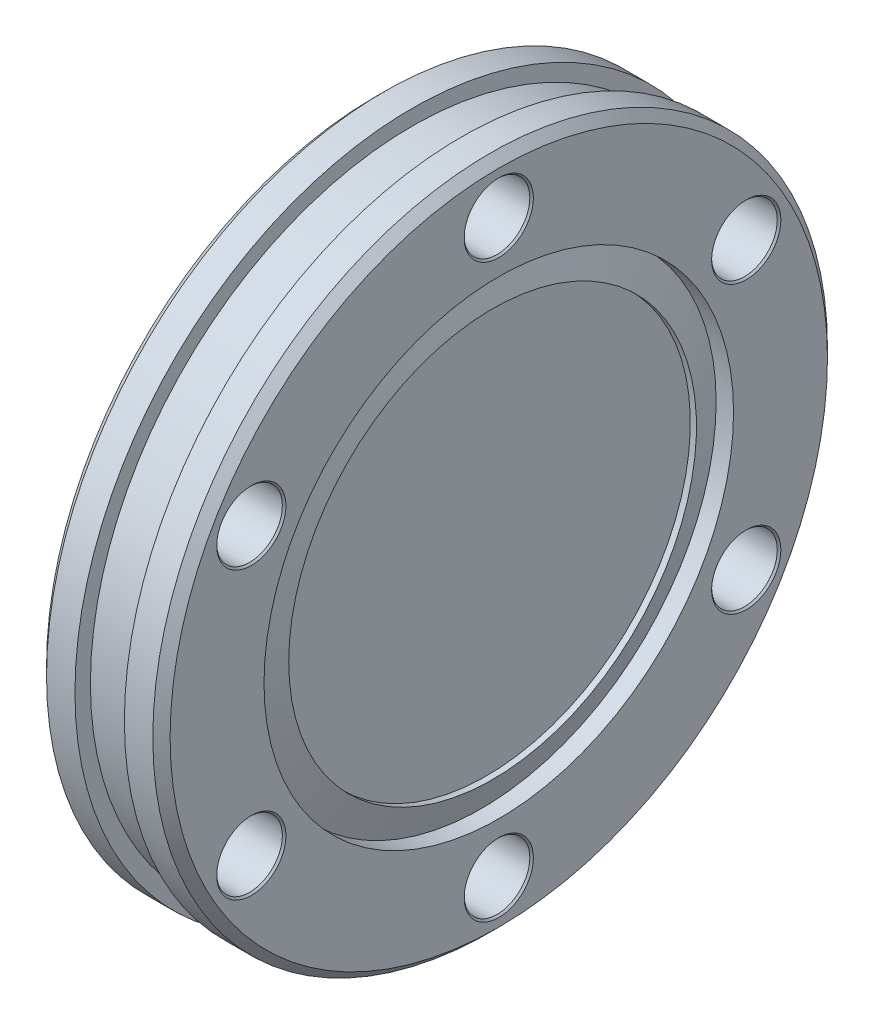
ISO-10303-21;
HEADER;
FILE_DESCRIPTION(('STEP AP214'),'2;1');
FILE_NAME('part.step','',(''),(''),'','','');
FILE_SCHEMA(('AUTOMOTIVE_DESIGN { 1 0 10303 214 1 1 1 1 }'));
ENDSEC;
DATA;
#1=APPLICATION_CONTEXT('core data for automotive mechanical design processes');
#2=APPLICATION_PROTOCOL_DEFINITION('international standard','automotive_design',2000,#1);
#3=PRODUCT_CONTEXT('',#1,'mechanical');
#4=PRODUCT('Part','Part','',(#3));
#5=PRODUCT_RELATED_PRODUCT_CATEGORY('part','',(#4));
#6=PRODUCT_DEFINITION_FORMATION('','',#4);
#7=PRODUCT_DEFINITION_CONTEXT('part definition',#1,'design');
#8=PRODUCT_DEFINITION('design','',#6,#7);
#9=PRODUCT_DEFINITION_SHAPE('','',#8);
#10=(LENGTH_UNIT() NAMED_UNIT(*) SI_UNIT(.MILLI.,.METRE.));
#11=(NAMED_UNIT(*) PLANE_ANGLE_UNIT() SI_UNIT($,.RADIAN.));
#12=(NAMED_UNIT(*) SI_UNIT($,.STERADIAN.) SOLID_ANGLE_UNIT());
#13=UNCERTAINTY_MEASURE_WITH_UNIT(LENGTH_MEASURE(1.E-05),#10,'distance_accuracy_value','');
#14=(GEOMETRIC_REPRESENTATION_CONTEXT(3) GLOBAL_UNCERTAINTY_ASSIGNED_CONTEXT((#13)) GLOBAL_UNIT_ASSIGNED_CONTEXT((#10,
#11,#12)) REPRESENTATION_CONTEXT('',''));
#15=CARTESIAN_POINT('',(0.,0.,0.));
#16=DIRECTION('',(0.,0.,1.));
#17=DIRECTION('',(1.,0.,0.));
#18=AXIS2_PLACEMENT_3D('',#15,#16,#17);
#19=CARTESIAN_POINT('',(-6.34999999999999,0.,0.));
#20=DIRECTION('',(-1.,0.,0.));
#21=DIRECTION('',(0.,0.,1.));
#22=AXIS2_PLACEMENT_3D('',#19,#20,#21);
#23=PLANE('',#22);
#24=CARTESIAN_POINT('',(-6.34999999999999,0.,0.));
#25=DIRECTION('',(-1.,0.,0.));
#26=DIRECTION('',(0.,0.,1.));
#27=AXIS2_PLACEMENT_3D('',#24,#25,#26);
#28=CIRCLE('',#27,33.782);
#29=CARTESIAN_POINT('',(-6.34999999999999,0.,33.782));
#30=VERTEX_POINT('',#29);
#31=EDGE_CURVE('E39',#30,#30,#28,.T.);
#32=ORIENTED_EDGE('',*,*,#31,.T.);
#33=EDGE_LOOP('',(#32));
#34=FACE_BOUND('',#33,.T.);
#35=CARTESIAN_POINT('',(-6.34999999999999,14.6843749999999,-25.4340835773943));
#36=DIRECTION('',(-1.,0.,0.));
#37=DIRECTION('',(0.,0.,1.));
#38=AXIS2_PLACEMENT_3D('',#35,#36,#37);
#39=CIRCLE('',#38,3.55599999995215);
#40=CARTESIAN_POINT('',(-6.34999999999999,14.6843749999999,-21.8780835774421));
#41=VERTEX_POINT('',#40);
#42=EDGE_CURVE('E106',#41,#41,#39,.F.);
#43=ORIENTED_EDGE('',*,*,#42,.T.);
#44=EDGE_LOOP('',(#43));
#45=FACE_BOUND('',#44,.T.);
#46=CARTESIAN_POINT('',(-6.34999999999999,29.36875,0.));
#47=DIRECTION('',(-1.,0.,0.));
#48=DIRECTION('',(0.,0.,1.));
#49=AXIS2_PLACEMENT_3D('',#46,#47,#48);
#50=CIRCLE('',#49,3.55599999995215);
#51=CARTESIAN_POINT('',(-6.34999999999999,29.36875,3.55599999995215));
#52=VERTEX_POINT('',#51);
#53=EDGE_CURVE('E109',#52,#52,#50,.F.);
#54=ORIENTED_EDGE('',*,*,#53,.T.);
#55=EDGE_LOOP('',(#54));
#56=FACE_BOUND('',#55,.T.);
#57=CARTESIAN_POINT('',(-6.34999999999999,-29.36875,2.05081003923162E-13));
#58=DIRECTION('',(-1.,0.,0.));
#59=DIRECTION('',(0.,0.,1.));
#60=AXIS2_PLACEMENT_3D('',#57,#58,#59);
#61=CIRCLE('',#60,3.55599999995213);
#62=CARTESIAN_POINT('',(-6.34999999999999,-29.36875,3.55599999995233));
#63=VERTEX_POINT('',#62);
#64=EDGE_CURVE('E112',#63,#63,#61,.F.);
#65=ORIENTED_EDGE('',*,*,#64,.T.);
#66=EDGE_LOOP('',(#65));
#67=FACE_BOUND('',#66,.T.);
#68=CARTESIAN_POINT('',(-6.34999999999999,-14.6843750000001,-25.4340835773942));
#69=DIRECTION('',(-1.,0.,0.));
#70=DIRECTION('',(0.,0.,1.));
#71=AXIS2_PLACEMENT_3D('',#68,#69,#70);
#72=CIRCLE('',#71,3.55599999995389);
#73=CARTESIAN_POINT('',(-6.34999999999999,-14.6843750000001,-21.8780835774403));
#74=VERTEX_POINT('',#73);
#75=EDGE_CURVE('E115',#74,#74,#72,.F.);
#76=ORIENTED_EDGE('',*,*,#75,.T.);
#77=EDGE_LOOP('',(#76));
#78=FACE_BOUND('',#77,.T.);
#79=CARTESIAN_POINT('',(-6.34999999999999,14.6843750000003,25.4340835773941));
#80=DIRECTION('',(-1.,0.,0.));
#81=DIRECTION('',(0.,0.,1.));
#82=AXIS2_PLACEMENT_3D('',#79,#80,#81);
#83=CIRCLE('',#82,3.55599999995215);
#84=CARTESIAN_POINT('',(-6.34999999999999,14.6843750000003,28.9900835773462));
#85=VERTEX_POINT('',#84);
#86=EDGE_CURVE('E118',#85,#85,#83,.F.);
#87=ORIENTED_EDGE('',*,*,#86,.T.);
#88=EDGE_LOOP('',(#87));
#89=FACE_BOUND('',#88,.T.);
#90=CARTESIAN_POINT('',(-6.34999999999999,-14.6843749999998,25.4340835773944));
#91=DIRECTION('',(-1.,0.,0.));
#92=DIRECTION('',(0.,0.,1.));
#93=AXIS2_PLACEMENT_3D('',#90,#91,#92);
#94=CIRCLE('',#93,3.55599999995389);
#95=CARTESIAN_POINT('',(-6.34999999999999,-14.6843749999998,28.9900835773483));
#96=VERTEX_POINT('',#95);
#97=EDGE_CURVE('E121',#96,#96,#94,.F.);
#98=ORIENTED_EDGE('',*,*,#97,.T.);
#99=EDGE_LOOP('',(#98));
#100=FACE_BOUND('',#99,.T.);
#101=ADVANCED_FACE('F32',(#34,#45,#56,#67,#78,#89,#100),#23,.T.);
#102=CARTESIAN_POINT('',(6.35000000000001,0.,0.));
#103=DIRECTION('',(-1.,0.,0.));
#104=DIRECTION('',(0.,0.,1.));
#105=AXIS2_PLACEMENT_3D('',#102,#103,#104);
#106=CYLINDRICAL_SURFACE('',#105,20.955);
#107=CARTESIAN_POINT('',(5.08000000000001,0.,0.));
#108=DIRECTION('',(-1.,0.,0.));
#109=DIRECTION('',(0.,0.,1.));
#110=AXIS2_PLACEMENT_3D('',#107,#108,#109);
#111=CIRCLE('',#110,20.955);
#112=CARTESIAN_POINT('',(5.08000000000001,0.,20.955));
#113=VERTEX_POINT('',#112);
#114=EDGE_CURVE('E145',#113,#113,#111,.T.);
#115=ORIENTED_EDGE('',*,*,#114,.T.);
#116=EDGE_LOOP('',(#115));
#117=FACE_BOUND('',#116,.T.);
#118=CARTESIAN_POINT('',(5.71500000000001,0.,0.));
#119=DIRECTION('',(-1.,0.,0.));
#120=DIRECTION('',(0.,0.,1.));
#121=AXIS2_PLACEMENT_3D('',#118,#119,#120);
#122=CIRCLE('',#121,20.955);
#123=CARTESIAN_POINT('',(5.71500000000001,0.,20.955));
#124=VERTEX_POINT('',#123);
#125=EDGE_CURVE('E124',#124,#124,#122,.T.);
#126=ORIENTED_EDGE('',*,*,#125,.F.);
#127=EDGE_LOOP('',(#126));
#128=FACE_BOUND('',#127,.T.);
#129=ADVANCED_FACE('F149',(#117,#128),#106,.F.);
#130=CARTESIAN_POINT('',(4.55939450620482,0.,0.));
#131=DIRECTION('',(-1.,0.,0.));
#132=DIRECTION('',(0.,0.,1.));
#133=AXIS2_PLACEMENT_3D('',#130,#131,#132);
#134=CONICAL_SURFACE('',#133,24.13,1.22173047639603);
#135=ORIENTED_EDGE('',*,*,#125,.T.);
#136=EDGE_LOOP('',(#135));
#137=FACE_BOUND('',#136,.T.);
#138=CARTESIAN_POINT('',(4.55939450620482,0.,0.));
#139=DIRECTION('',(-1.,0.,0.));
#140=DIRECTION('',(0.,0.,1.));
#141=AXIS2_PLACEMENT_3D('',#138,#139,#140);
#142=CIRCLE('',#141,24.13);
#143=CARTESIAN_POINT('',(4.55939450620482,0.,24.13));
#144=VERTEX_POINT('',#143);
#145=EDGE_CURVE('E127',#144,#144,#142,.T.);
#146=ORIENTED_EDGE('',*,*,#145,.F.);
#147=EDGE_LOOP('',(#146));
#148=FACE_BOUND('',#147,.T.);
#149=ADVANCED_FACE('F171',(#137,#148),#134,.T.);
#150=CARTESIAN_POINT('',(6.35000000000001,0.,0.));
#151=DIRECTION('',(-1.,0.,0.));
#152=DIRECTION('',(0.,0.,1.));
#153=AXIS2_PLACEMENT_3D('',#150,#151,#152);
#154=CYLINDRICAL_SURFACE('',#153,24.13);
#155=ORIENTED_EDGE('',*,*,#145,.T.);
#156=EDGE_LOOP('',(#155));
#157=FACE_BOUND('',#156,.T.);
#158=CARTESIAN_POINT('',(6.35000000000001,0.,0.));
#159=DIRECTION('',(-1.,0.,0.));
#160=DIRECTION('',(0.,0.,1.));
#161=AXIS2_PLACEMENT_3D('',#158,#159,#160);
#162=CIRCLE('',#161,24.13);
#163=CARTESIAN_POINT('',(6.35000000000001,0.,24.13));
#164=VERTEX_POINT('',#163);
#165=EDGE_CURVE('E130',#164,#164,#162,.T.);
#166=ORIENTED_EDGE('',*,*,#165,.F.);
#167=EDGE_LOOP('',(#166));
#168=FACE_BOUND('',#167,.T.);
#169=ADVANCED_FACE('F193',(#157,#168),#154,.F.);
#170=CARTESIAN_POINT('',(6.35000000000001,34.671,0.));
#171=DIRECTION('',(1.,0.,0.));
#172=DIRECTION('',(0.,0.,-1.));
#173=AXIS2_PLACEMENT_3D('',#170,#171,#172);
#174=PLANE('',#173);
#175=CARTESIAN_POINT('',(6.35000000000001,0.,0.));
#176=DIRECTION('',(1.,0.,0.));
#177=DIRECTION('',(0.,0.,-1.));
#178=AXIS2_PLACEMENT_3D('',#175,#176,#177);
#179=CIRCLE('',#178,33.782);
#180=CARTESIAN_POINT('',(6.35000000000001,0.,-33.782));
#181=VERTEX_POINT('',#180);
#182=EDGE_CURVE('E43',#181,#181,#179,.T.);
#183=ORIENTED_EDGE('',*,*,#182,.T.);
#184=EDGE_LOOP('',(#183));
#185=FACE_BOUND('',#184,.T.);
#186=CARTESIAN_POINT('',(6.35000000000001,-14.6843749999998,25.4340835773944));
#187=DIRECTION('',(1.,0.,0.));
#188=DIRECTION('',(0.,0.,-1.));
#189=AXIS2_PLACEMENT_3D('',#186,#187,#188);
#190=CIRCLE('',#189,3.55599999995217);
#191=CARTESIAN_POINT('',(6.35000000000001,-14.6843749999998,21.8780835774422));
#192=VERTEX_POINT('',#191);
#193=EDGE_CURVE('E76',#192,#192,#190,.F.);
#194=ORIENTED_EDGE('',*,*,#193,.T.);
#195=EDGE_LOOP('',(#194));
#196=FACE_BOUND('',#195,.T.);
#197=CARTESIAN_POINT('',(6.35000000000001,-14.6843750000001,-25.4340835773942));
#198=DIRECTION('',(1.,0.,0.));
#199=DIRECTION('',(0.,0.,-1.));
#200=AXIS2_PLACEMENT_3D('',#197,#198,#199);
#201=CIRCLE('',#200,3.55599999995217);
#202=CARTESIAN_POINT('',(6.35000000000001,-14.6843750000001,-28.9900835773463));
#203=VERTEX_POINT('',#202);
#204=EDGE_CURVE('E79',#203,#203,#201,.F.);
#205=ORIENTED_EDGE('',*,*,#204,.T.);
#206=EDGE_LOOP('',(#205));
#207=FACE_BOUND('',#206,.T.);
#208=CARTESIAN_POINT('',(6.35000000000001,29.36875,0.));
#209=DIRECTION('',(1.,0.,0.));
#210=DIRECTION('',(0.,0.,-1.));
#211=AXIS2_PLACEMENT_3D('',#208,#209,#210);
#212=CIRCLE('',#211,3.55599999995386);
#213=CARTESIAN_POINT('',(6.35000000000001,29.36875,-3.55599999995386));
#214=VERTEX_POINT('',#213);
#215=EDGE_CURVE('E82',#214,#214,#212,.F.);
#216=ORIENTED_EDGE('',*,*,#215,.T.);
#217=EDGE_LOOP('',(#216));
#218=FACE_BOUND('',#217,.T.);
#219=CARTESIAN_POINT('',(6.35000000000001,14.6843749999999,-25.4340835773943));
#220=DIRECTION('',(1.,0.,0.));
#221=DIRECTION('',(0.,0.,-1.));
#222=AXIS2_PLACEMENT_3D('',#219,#220,#221);
#223=CIRCLE('',#222,3.55599999995386);
#224=CARTESIAN_POINT('',(6.35000000000001,14.6843749999999,-28.9900835773481));
#225=VERTEX_POINT('',#224);
#226=EDGE_CURVE('E85',#225,#225,#223,.F.);
#227=ORIENTED_EDGE('',*,*,#226,.T.);
#228=EDGE_LOOP('',(#227));
#229=FACE_BOUND('',#228,.T.);
#230=CARTESIAN_POINT('',(6.35000000000001,-29.36875,2.05081003923162E-13));
#231=DIRECTION('',(1.,0.,0.));
#232=DIRECTION('',(0.,0.,-1.));
#233=AXIS2_PLACEMENT_3D('',#230,#231,#232);
#234=CIRCLE('',#233,3.55599999995386);
#235=CARTESIAN_POINT('',(6.35000000000001,-29.36875,-3.55599999995365));
#236=VERTEX_POINT('',#235);
#237=EDGE_CURVE('E88',#236,#236,#234,.F.);
#238=ORIENTED_EDGE('',*,*,#237,.T.);
#239=EDGE_LOOP('',(#238));
#240=FACE_BOUND('',#239,.T.);
#241=CARTESIAN_POINT('',(6.35000000000001,14.6843750000003,25.4340835773941));
#242=DIRECTION('',(1.,0.,0.));
#243=DIRECTION('',(0.,0.,-1.));
#244=AXIS2_PLACEMENT_3D('',#241,#242,#243);
#245=CIRCLE('',#244,3.55599999995386);
#246=CARTESIAN_POINT('',(6.35000000000001,14.6843750000003,21.8780835774402));
#247=VERTEX_POINT('',#246);
#248=EDGE_CURVE('E91',#247,#247,#245,.F.);
#249=ORIENTED_EDGE('',*,*,#248,.T.);
#250=EDGE_LOOP('',(#249));
#251=FACE_BOUND('',#250,.T.);
#252=ORIENTED_EDGE('',*,*,#165,.T.);
#253=EDGE_LOOP('',(#252));
#254=FACE_BOUND('',#253,.T.);
#255=ADVANCED_FACE('F189',(#185,#196,#207,#218,#229,#240,#251,#254),#174,.T.);
#256=CARTESIAN_POINT('',(6.35000000000001,0.,0.));
#257=DIRECTION('',(-1.,0.,0.));
#258=DIRECTION('',(0.,0.,1.));
#259=AXIS2_PLACEMENT_3D('',#256,#257,#258);
#260=CYLINDRICAL_SURFACE('',#259,34.671);
#261=CARTESIAN_POINT('',(5.46100000000003,0.,0.));
#262=DIRECTION('',(1.,0.,0.));
#263=DIRECTION('',(0.,0.,-1.));
#264=AXIS2_PLACEMENT_3D('',#261,#262,#263);
#265=CIRCLE('',#264,34.671);
#266=CARTESIAN_POINT('',(5.46100000000003,0.,-34.671));
#267=VERTEX_POINT('',#266);
#268=EDGE_CURVE('E47',#267,#267,#265,.F.);
#269=ORIENTED_EDGE('',*,*,#268,.T.);
#270=EDGE_LOOP('',(#269));
#271=FACE_BOUND('',#270,.T.);
#272=CARTESIAN_POINT('',(2.54,0.,0.));
#273=DIRECTION('',(-1.,0.,0.));
#274=DIRECTION('',(0.,0.,1.));
#275=AXIS2_PLACEMENT_3D('',#272,#273,#274);
#276=CIRCLE('',#275,34.671);
#277=CARTESIAN_POINT('',(2.54,0.,34.671));
#278=VERTEX_POINT('',#277);
#279=EDGE_CURVE('E133',#278,#278,#276,.T.);
#280=ORIENTED_EDGE('',*,*,#279,.F.);
#281=EDGE_LOOP('',(#280));
#282=FACE_BOUND('',#281,.T.);
#283=ADVANCED_FACE('F185',(#271,#282),#260,.T.);
#284=CARTESIAN_POINT('',(2.54,33.0835,0.));
#285=DIRECTION('',(-1.,0.,0.));
#286=DIRECTION('',(0.,0.,1.));
#287=AXIS2_PLACEMENT_3D('',#284,#285,#286);
#288=PLANE('',#287);
#289=ORIENTED_EDGE('',*,*,#279,.T.);
#290=EDGE_LOOP('',(#289));
#291=FACE_BOUND('',#290,.T.);
#292=CARTESIAN_POINT('',(2.54,0.,0.));
#293=DIRECTION('',(-1.,0.,0.));
#294=DIRECTION('',(0.,0.,1.));
#295=AXIS2_PLACEMENT_3D('',#292,#293,#294);
#296=CIRCLE('',#295,33.0835);
#297=CARTESIAN_POINT('',(2.54,0.,33.0835));
#298=VERTEX_POINT('',#297);
#299=EDGE_CURVE('E136',#298,#298,#296,.T.);
#300=ORIENTED_EDGE('',*,*,#299,.F.);
#301=EDGE_LOOP('',(#300));
#302=FACE_BOUND('',#301,.T.);
#303=ADVANCED_FACE('F181',(#291,#302),#288,.T.);
#304=CARTESIAN_POINT('',(6.35000000000001,0.,0.));
#305=DIRECTION('',(-1.,0.,0.));
#306=DIRECTION('',(0.,0.,1.));
#307=AXIS2_PLACEMENT_3D('',#304,#305,#306);
#308=CYLINDRICAL_SURFACE('',#307,33.0835);
#309=ORIENTED_EDGE('',*,*,#299,.T.);
#310=EDGE_LOOP('',(#309));
#311=FACE_BOUND('',#310,.T.);
#312=CARTESIAN_POINT('',(-2.54,0.,0.));
#313=DIRECTION('',(-1.,0.,0.));
#314=DIRECTION('',(0.,0.,1.));
#315=AXIS2_PLACEMENT_3D('',#312,#313,#314);
#316=CIRCLE('',#315,33.0835);
#317=CARTESIAN_POINT('',(-2.54,0.,33.0835));
#318=VERTEX_POINT('',#317);
#319=EDGE_CURVE('E139',#318,#318,#316,.T.);
#320=ORIENTED_EDGE('',*,*,#319,.F.);
#321=EDGE_LOOP('',(#320));
#322=FACE_BOUND('',#321,.T.);
#323=ADVANCED_FACE('F177',(#311,#322),#308,.T.);
#324=CARTESIAN_POINT('',(-2.54,34.671,0.));
#325=DIRECTION('',(1.,0.,0.));
#326=DIRECTION('',(0.,0.,-1.));
#327=AXIS2_PLACEMENT_3D('',#324,#325,#326);
#328=PLANE('',#327);
#329=ORIENTED_EDGE('',*,*,#319,.T.);
#330=EDGE_LOOP('',(#329));
#331=FACE_BOUND('',#330,.T.);
#332=CARTESIAN_POINT('',(-2.54,0.,0.));
#333=DIRECTION('',(-1.,0.,0.));
#334=DIRECTION('',(0.,0.,1.));
#335=AXIS2_PLACEMENT_3D('',#332,#333,#334);
#336=CIRCLE('',#335,34.671);
#337=CARTESIAN_POINT('',(-2.54,0.,34.671));
#338=VERTEX_POINT('',#337);
#339=EDGE_CURVE('E142',#338,#338,#336,.T.);
#340=ORIENTED_EDGE('',*,*,#339,.F.);
#341=EDGE_LOOP('',(#340));
#342=FACE_BOUND('',#341,.T.);
#343=ADVANCED_FACE('F164',(#331,#342),#328,.T.);
#344=CARTESIAN_POINT('',(6.35000000000001,0.,0.));
#345=DIRECTION('',(-1.,0.,0.));
#346=DIRECTION('',(0.,0.,1.));
#347=AXIS2_PLACEMENT_3D('',#344,#345,#346);
#348=CYLINDRICAL_SURFACE('',#347,34.671);
#349=CARTESIAN_POINT('',(-5.46099999999995,0.,0.));
#350=DIRECTION('',(-1.,0.,0.));
#351=DIRECTION('',(0.,0.,1.));
#352=AXIS2_PLACEMENT_3D('',#349,#350,#351);
#353=CIRCLE('',#352,34.671);
#354=CARTESIAN_POINT('',(-5.46099999999995,0.,34.671));
#355=VERTEX_POINT('',#354);
#356=EDGE_CURVE('E10',#355,#355,#353,.F.);
#357=ORIENTED_EDGE('',*,*,#356,.T.);
#358=EDGE_LOOP('',(#357));
#359=FACE_BOUND('',#358,.T.);
#360=ORIENTED_EDGE('',*,*,#339,.T.);
#361=EDGE_LOOP('',(#360));
#362=FACE_BOUND('',#361,.T.);
#363=ADVANCED_FACE('F155',(#359,#362),#348,.T.);
#364=CARTESIAN_POINT('',(5.08000000000001,20.955,0.));
#365=DIRECTION('',(1.,0.,0.));
#366=DIRECTION('',(0.,0.,-1.));
#367=AXIS2_PLACEMENT_3D('',#364,#365,#366);
#368=PLANE('',#367);
#369=ORIENTED_EDGE('',*,*,#114,.F.);
#370=EDGE_LOOP('',(#369));
#371=FACE_BOUND('',#370,.T.);
#372=ADVANCED_FACE('F152',(#371),#368,.T.);
#373=CARTESIAN_POINT('',(6.35000000000001,14.6843750000003,25.4340835773941));
#374=DIRECTION('',(1.,0.,0.));
#375=DIRECTION('',(0.,0.,-1.));
#376=AXIS2_PLACEMENT_3D('',#373,#374,#375);
#377=CYLINDRICAL_SURFACE('',#376,3.37311999999999);
#378=CARTESIAN_POINT('',(-6.16712000004613,14.6843750000003,25.4340835773941));
#379=DIRECTION('',(-1.,0.,0.));
#380=DIRECTION('',(0.,0.,1.));
#381=AXIS2_PLACEMENT_3D('',#378,#379,#380);
#382=CIRCLE('',#381,3.37311999999999);
#383=CARTESIAN_POINT('',(-6.16712000004613,14.6843750000003,28.807203577394));
#384=VERTEX_POINT('',#383);
#385=EDGE_CURVE('E52',#384,#384,#382,.T.);
#386=ORIENTED_EDGE('',*,*,#385,.T.);
#387=EDGE_LOOP('',(#386));
#388=FACE_BOUND('',#387,.T.);
#389=CARTESIAN_POINT('',(6.16712000004784,14.6843750000003,25.4340835773941));
#390=DIRECTION('',(1.,0.,0.));
#391=DIRECTION('',(0.,0.,-1.));
#392=AXIS2_PLACEMENT_3D('',#389,#390,#391);
#393=CIRCLE('',#392,3.37311999999999);
#394=CARTESIAN_POINT('',(6.16712000004784,14.6843750000003,22.0609635773941));
#395=VERTEX_POINT('',#394);
#396=EDGE_CURVE('E55',#395,#395,#393,.T.);
#397=ORIENTED_EDGE('',*,*,#396,.T.);
#398=EDGE_LOOP('',(#397));
#399=FACE_BOUND('',#398,.T.);
#400=ADVANCED_FACE('F154',(#388,#399),#377,.F.);
#401=CARTESIAN_POINT('',(6.35000000000001,-29.36875,2.05081003923162E-13));
#402=DIRECTION('',(1.,0.,0.));
#403=DIRECTION('',(0.,0.,-1.));
#404=AXIS2_PLACEMENT_3D('',#401,#402,#403);
#405=CYLINDRICAL_SURFACE('',#404,3.37311999999999);
#406=CARTESIAN_POINT('',(-6.16712000004615,-29.36875,2.05081003923162E-13));
#407=DIRECTION('',(-1.,0.,0.));
#408=DIRECTION('',(0.,0.,1.));
#409=AXIS2_PLACEMENT_3D('',#406,#407,#408);
#410=CIRCLE('',#409,3.37311999999999);
#411=CARTESIAN_POINT('',(-6.16712000004615,-29.36875,3.37312000000019));
#412=VERTEX_POINT('',#411);
#413=EDGE_CURVE('E64',#412,#412,#410,.T.);
#414=ORIENTED_EDGE('',*,*,#413,.T.);
#415=EDGE_LOOP('',(#414));
#416=FACE_BOUND('',#415,.T.);
#417=CARTESIAN_POINT('',(6.16712000004784,-29.36875,2.05081003923162E-13));
#418=DIRECTION('',(1.,0.,0.));
#419=DIRECTION('',(0.,0.,-1.));
#420=AXIS2_PLACEMENT_3D('',#417,#418,#419);
#421=CIRCLE('',#420,3.37311999999999);
#422=CARTESIAN_POINT('',(6.16712000004784,-29.36875,-3.37311999999978));
#423=VERTEX_POINT('',#422);
#424=EDGE_CURVE('E67',#423,#423,#421,.T.);
#425=ORIENTED_EDGE('',*,*,#424,.T.);
#426=EDGE_LOOP('',(#425));
#427=FACE_BOUND('',#426,.T.);
#428=ADVANCED_FACE('F161',(#416,#427),#405,.F.);
#429=CARTESIAN_POINT('',(6.35000000000001,14.6843749999999,-25.4340835773943));
#430=DIRECTION('',(1.,0.,0.));
#431=DIRECTION('',(0.,0.,-1.));
#432=AXIS2_PLACEMENT_3D('',#429,#430,#431);
#433=CYLINDRICAL_SURFACE('',#432,3.37311999999999);
#434=CARTESIAN_POINT('',(-6.16712000004613,14.6843749999999,-25.4340835773943));
#435=DIRECTION('',(-1.,0.,0.));
#436=DIRECTION('',(0.,0.,1.));
#437=AXIS2_PLACEMENT_3D('',#434,#435,#436);
#438=CIRCLE('',#437,3.37311999999999);
#439=CARTESIAN_POINT('',(-6.16712000004613,14.6843749999999,-22.0609635773943));
#440=VERTEX_POINT('',#439);
#441=EDGE_CURVE('E100',#440,#440,#438,.T.);
#442=ORIENTED_EDGE('',*,*,#441,.T.);
#443=EDGE_LOOP('',(#442));
#444=FACE_BOUND('',#443,.T.);
#445=CARTESIAN_POINT('',(6.16712000004784,14.6843749999999,-25.4340835773943));
#446=DIRECTION('',(1.,0.,0.));
#447=DIRECTION('',(0.,0.,-1.));
#448=AXIS2_PLACEMENT_3D('',#445,#446,#447);
#449=CIRCLE('',#448,3.37311999999999);
#450=CARTESIAN_POINT('',(6.16712000004784,14.6843749999999,-28.8072035773943));
#451=VERTEX_POINT('',#450);
#452=EDGE_CURVE('E103',#451,#451,#449,.T.);
#453=ORIENTED_EDGE('',*,*,#452,.T.);
#454=EDGE_LOOP('',(#453));
#455=FACE_BOUND('',#454,.T.);
#456=ADVANCED_FACE('F290',(#444,#455),#433,.F.);
#457=CARTESIAN_POINT('',(6.35000000000001,29.36875,0.));
#458=DIRECTION('',(1.,0.,0.));
#459=DIRECTION('',(0.,0.,-1.));
#460=AXIS2_PLACEMENT_3D('',#457,#458,#459);
#461=CYLINDRICAL_SURFACE('',#460,3.37311999999999);
#462=CARTESIAN_POINT('',(-6.16712000004612,29.36875,0.));
#463=DIRECTION('',(-1.,0.,0.));
#464=DIRECTION('',(0.,0.,1.));
#465=AXIS2_PLACEMENT_3D('',#462,#463,#464);
#466=CIRCLE('',#465,3.37311999999999);
#467=CARTESIAN_POINT('',(-6.16712000004612,29.36875,3.37311999999999));
#468=VERTEX_POINT('',#467);
#469=EDGE_CURVE('E94',#468,#468,#466,.T.);
#470=ORIENTED_EDGE('',*,*,#469,.T.);
#471=EDGE_LOOP('',(#470));
#472=FACE_BOUND('',#471,.T.);
#473=CARTESIAN_POINT('',(6.16712000004784,29.36875,0.));
#474=DIRECTION('',(1.,0.,0.));
#475=DIRECTION('',(0.,0.,-1.));
#476=AXIS2_PLACEMENT_3D('',#473,#474,#475);
#477=CIRCLE('',#476,3.37311999999999);
#478=CARTESIAN_POINT('',(6.16712000004784,29.36875,-3.37311999999999));
#479=VERTEX_POINT('',#478);
#480=EDGE_CURVE('E97',#479,#479,#477,.T.);
#481=ORIENTED_EDGE('',*,*,#480,.T.);
#482=EDGE_LOOP('',(#481));
#483=FACE_BOUND('',#482,.T.);
#484=ADVANCED_FACE('F296',(#472,#483),#461,.F.);
#485=CARTESIAN_POINT('',(-6.34999999999999,-14.6843750000001,-25.4340835773942));
#486=DIRECTION('',(-1.,0.,0.));
#487=DIRECTION('',(0.,0.,1.));
#488=AXIS2_PLACEMENT_3D('',#485,#486,#487);
#489=CYLINDRICAL_SURFACE('',#488,3.37311999999999);
#490=CARTESIAN_POINT('',(6.16712000004616,-14.6843750000001,-25.4340835773942));
#491=DIRECTION('',(1.,0.,0.));
#492=DIRECTION('',(0.,0.,-1.));
#493=AXIS2_PLACEMENT_3D('',#490,#491,#492);
#494=CIRCLE('',#493,3.37311999999999);
#495=CARTESIAN_POINT('',(6.16712000004616,-14.6843750000001,-28.8072035773942));
#496=VERTEX_POINT('',#495);
#497=EDGE_CURVE('E58',#496,#496,#494,.T.);
#498=ORIENTED_EDGE('',*,*,#497,.T.);
#499=EDGE_LOOP('',(#498));
#500=FACE_BOUND('',#499,.T.);
#501=CARTESIAN_POINT('',(-6.16712000004779,-14.6843750000001,-25.4340835773942));
#502=DIRECTION('',(-1.,0.,0.));
#503=DIRECTION('',(0.,0.,1.));
#504=AXIS2_PLACEMENT_3D('',#501,#502,#503);
#505=CIRCLE('',#504,3.37311999999999);
#506=CARTESIAN_POINT('',(-6.16712000004779,-14.6843750000001,-22.0609635773942));
#507=VERTEX_POINT('',#506);
#508=EDGE_CURVE('E61',#507,#507,#505,.T.);
#509=ORIENTED_EDGE('',*,*,#508,.T.);
#510=EDGE_LOOP('',(#509));
#511=FACE_BOUND('',#510,.T.);
#512=ADVANCED_FACE('F302',(#500,#511),#489,.F.);
#513=CARTESIAN_POINT('',(-6.34999999999999,-14.6843749999998,25.4340835773944));
#514=DIRECTION('',(-1.,0.,0.));
#515=DIRECTION('',(0.,0.,1.));
#516=AXIS2_PLACEMENT_3D('',#513,#514,#515);
#517=CYLINDRICAL_SURFACE('',#516,3.37311999999999);
#518=CARTESIAN_POINT('',(6.16712000004616,-14.6843749999998,25.4340835773944));
#519=DIRECTION('',(1.,0.,0.));
#520=DIRECTION('',(0.,0.,-1.));
#521=AXIS2_PLACEMENT_3D('',#518,#519,#520);
#522=CIRCLE('',#521,3.37311999999999);
#523=CARTESIAN_POINT('',(6.16712000004616,-14.6843749999998,22.0609635773944));
#524=VERTEX_POINT('',#523);
#525=EDGE_CURVE('E70',#524,#524,#522,.T.);
#526=ORIENTED_EDGE('',*,*,#525,.T.);
#527=EDGE_LOOP('',(#526));
#528=FACE_BOUND('',#527,.T.);
#529=CARTESIAN_POINT('',(-6.16712000004779,-14.6843749999998,25.4340835773944));
#530=DIRECTION('',(-1.,0.,0.));
#531=DIRECTION('',(0.,0.,1.));
#532=AXIS2_PLACEMENT_3D('',#529,#530,#531);
#533=CIRCLE('',#532,3.37311999999999);
#534=CARTESIAN_POINT('',(-6.16712000004779,-14.6843749999998,28.8072035773944));
#535=VERTEX_POINT('',#534);
#536=EDGE_CURVE('E73',#535,#535,#533,.T.);
#537=ORIENTED_EDGE('',*,*,#536,.T.);
#538=EDGE_LOOP('',(#537));
#539=FACE_BOUND('',#538,.T.);
#540=ADVANCED_FACE('F205',(#528,#539),#517,.F.);
#541=CARTESIAN_POINT('',(-6.34999999999999,14.6843749999999,-25.4340835773943));
#542=DIRECTION('',(-1.,0.,0.));
#543=DIRECTION('',(0.,0.,1.));
#544=AXIS2_PLACEMENT_3D('',#541,#542,#543);
#545=CONICAL_SURFACE('',#544,3.55599999995215,0.785398163392824);
#546=ORIENTED_EDGE('',*,*,#441,.F.);
#547=EDGE_LOOP('',(#546));
#548=FACE_BOUND('',#547,.T.);
#549=ORIENTED_EDGE('',*,*,#42,.F.);
#550=EDGE_LOOP('',(#549));
#551=FACE_BOUND('',#550,.T.);
#552=ADVANCED_FACE('F201',(#548,#551),#545,.F.);
#553=CARTESIAN_POINT('',(-6.34999999999999,29.36875,0.));
#554=DIRECTION('',(-1.,0.,0.));
#555=DIRECTION('',(0.,0.,1.));
#556=AXIS2_PLACEMENT_3D('',#553,#554,#555);
#557=CONICAL_SURFACE('',#556,3.55599999995215,0.785398163392791);
#558=ORIENTED_EDGE('',*,*,#469,.F.);
#559=EDGE_LOOP('',(#558));
#560=FACE_BOUND('',#559,.T.);
#561=ORIENTED_EDGE('',*,*,#53,.F.);
#562=EDGE_LOOP('',(#561));
#563=FACE_BOUND('',#562,.T.);
#564=ADVANCED_FACE('F204',(#560,#563),#557,.F.);
#565=CARTESIAN_POINT('',(6.35000000000001,-14.6843749999998,25.4340835773944));
#566=DIRECTION('',(1.,0.,0.));
#567=DIRECTION('',(0.,0.,-1.));
#568=AXIS2_PLACEMENT_3D('',#565,#566,#567);
#569=CONICAL_SURFACE('',#568,3.55599999995217,0.785398163392864);
#570=ORIENTED_EDGE('',*,*,#525,.F.);
#571=EDGE_LOOP('',(#570));
#572=FACE_BOUND('',#571,.T.);
#573=ORIENTED_EDGE('',*,*,#193,.F.);
#574=EDGE_LOOP('',(#573));
#575=FACE_BOUND('',#574,.T.);
#576=ADVANCED_FACE('F209',(#572,#575),#569,.F.);
#577=CARTESIAN_POINT('',(-6.34999999999999,-29.36875,2.05081003923162E-13));
#578=DIRECTION('',(-1.,0.,0.));
#579=DIRECTION('',(0.,0.,1.));
#580=AXIS2_PLACEMENT_3D('',#577,#578,#579);
#581=CONICAL_SURFACE('',#580,3.55599999995213,0.785398163392791);
#582=ORIENTED_EDGE('',*,*,#413,.F.);
#583=EDGE_LOOP('',(#582));
#584=FACE_BOUND('',#583,.T.);
#585=ORIENTED_EDGE('',*,*,#64,.F.);
#586=EDGE_LOOP('',(#585));
#587=FACE_BOUND('',#586,.T.);
#588=ADVANCED_FACE('F213',(#584,#587),#581,.F.);
#589=CARTESIAN_POINT('',(6.35000000000001,-14.6843750000001,-25.4340835773942));
#590=DIRECTION('',(1.,0.,0.));
#591=DIRECTION('',(0.,0.,-1.));
#592=AXIS2_PLACEMENT_3D('',#589,#590,#591);
#593=CONICAL_SURFACE('',#592,3.55599999995217,0.785398163392864);
#594=ORIENTED_EDGE('',*,*,#497,.F.);
#595=EDGE_LOOP('',(#594));
#596=FACE_BOUND('',#595,.T.);
#597=ORIENTED_EDGE('',*,*,#204,.F.);
#598=EDGE_LOOP('',(#597));
#599=FACE_BOUND('',#598,.T.);
#600=ADVANCED_FACE('F217',(#596,#599),#593,.F.);
#601=CARTESIAN_POINT('',(-6.16712000004779,-14.6843750000001,-25.4340835773942));
#602=DIRECTION('',(-1.,0.,0.));
#603=DIRECTION('',(0.,0.,1.));
#604=AXIS2_PLACEMENT_3D('',#601,#602,#603);
#605=CONICAL_SURFACE('',#604,3.37311999999999,0.785398163402099);
#606=ORIENTED_EDGE('',*,*,#75,.F.);
#607=EDGE_LOOP('',(#606));
#608=FACE_BOUND('',#607,.T.);
#609=ORIENTED_EDGE('',*,*,#508,.F.);
#610=EDGE_LOOP('',(#609));
#611=FACE_BOUND('',#610,.T.);
#612=ADVANCED_FACE('F221',(#608,#611),#605,.F.);
#613=CARTESIAN_POINT('',(6.16712000004784,29.36875,0.));
#614=DIRECTION('',(1.,0.,0.));
#615=DIRECTION('',(0.,0.,-1.));
#616=AXIS2_PLACEMENT_3D('',#613,#614,#615);
#617=CONICAL_SURFACE('',#616,3.37311999999999,0.785398163402099);
#618=ORIENTED_EDGE('',*,*,#215,.F.);
#619=EDGE_LOOP('',(#618));
#620=FACE_BOUND('',#619,.T.);
#621=ORIENTED_EDGE('',*,*,#480,.F.);
#622=EDGE_LOOP('',(#621));
#623=FACE_BOUND('',#622,.T.);
#624=ADVANCED_FACE('F225',(#620,#623),#617,.F.);
#625=CARTESIAN_POINT('',(6.16712000004784,14.6843749999999,-25.4340835773943));
#626=DIRECTION('',(1.,0.,0.));
#627=DIRECTION('',(0.,0.,-1.));
#628=AXIS2_PLACEMENT_3D('',#625,#626,#627);
#629=CONICAL_SURFACE('',#628,3.37311999999999,0.785398163402101);
#630=CARTESIAN_POINT('',(6.35000000000001,14.6843749999999,-28.9900835773481));
#631=CARTESIAN_POINT('',(6.34809500000051,14.6843749999999,-28.9881785773486));
#632=CARTESIAN_POINT('',(6.34619000000101,14.6843749999999,-28.9862735773491));
#633=CARTESIAN_POINT('',(6.342380000002,14.6843749999999,-28.98246357735));
#634=CARTESIAN_POINT('',(6.3404750000025,14.6843749999999,-28.9805585773505));
#635=CARTESIAN_POINT('',(6.3366650000035,14.6843749999999,-28.9767485773515));
#636=CARTESIAN_POINT('',(6.334760000004,14.6843749999999,-28.974843577352));
#637=CARTESIAN_POINT('',(6.33095000000499,14.6843749999999,-28.9710335773529));
#638=CARTESIAN_POINT('',(6.32904500000549,14.6843749999999,-28.9691285773534));
#639=CARTESIAN_POINT('',(6.32523500000649,14.6843749999999,-28.9653185773544));
#640=CARTESIAN_POINT('',(6.32333000000699,14.6843749999999,-28.9634135773549));
#641=CARTESIAN_POINT('',(6.31952000000798,14.6843749999999,-28.9596035773558));
#642=CARTESIAN_POINT('',(6.31761500000848,14.6843749999999,-28.9576985773563));
#643=CARTESIAN_POINT('',(6.31380500000948,14.6843749999999,-28.9538885773573));
#644=CARTESIAN_POINT('',(6.31190000000998,14.6843749999999,-28.9519835773577));
#645=CARTESIAN_POINT('',(6.30809000001097,14.6843749999999,-28.9481735773587));
#646=CARTESIAN_POINT('',(6.30618500001147,14.6843749999999,-28.9462685773592));
#647=CARTESIAN_POINT('',(6.30237500001247,14.6843749999999,-28.9424585773601));
#648=CARTESIAN_POINT('',(6.30047000001297,14.6843749999999,-28.9405535773606));
#649=CARTESIAN_POINT('',(6.29666000001396,14.6843749999999,-28.9367435773616));
#650=CARTESIAN_POINT('',(6.29475500001446,14.6843749999999,-28.9348385773621));
#651=CARTESIAN_POINT('',(6.29094500001546,14.6843749999999,-28.931028577363));
#652=CARTESIAN_POINT('',(6.28904000001595,14.6843749999999,-28.9291235773635));
#653=CARTESIAN_POINT('',(6.28523000001695,14.6843749999999,-28.9253135773645));
#654=CARTESIAN_POINT('',(6.28332500001745,14.6843749999999,-28.9234085773649));
#655=CARTESIAN_POINT('',(6.27951500001845,14.6843749999999,-28.9195985773659));
#656=CARTESIAN_POINT('',(6.27761000001894,14.6843749999999,-28.9176935773664));
#657=CARTESIAN_POINT('',(6.27380000001994,14.6843749999999,-28.9138835773673));
#658=CARTESIAN_POINT('',(6.27189500002044,14.6843749999999,-28.9119785773678));
#659=CARTESIAN_POINT('',(6.26808500002144,14.6843749999999,-28.9081685773688));
#660=CARTESIAN_POINT('',(6.26618000002193,14.6843749999999,-28.9062635773693));
#661=CARTESIAN_POINT('',(6.26237000002293,14.6843749999999,-28.9024535773702));
#662=CARTESIAN_POINT('',(6.26046500002343,14.6843749999999,-28.9005485773707));
#663=CARTESIAN_POINT('',(6.25665500002443,14.6843749999999,-28.8967385773717));
#664=CARTESIAN_POINT('',(6.25475000002492,14.6843749999999,-28.8948335773722));
#665=CARTESIAN_POINT('',(6.25094000002592,14.6843749999999,-28.8910235773731));
#666=CARTESIAN_POINT('',(6.24903500002642,14.6843749999999,-28.8891185773736));
#667=CARTESIAN_POINT('',(6.24522500002741,14.6843749999999,-28.8853085773746));
#668=CARTESIAN_POINT('',(6.24332000002791,14.6843749999999,-28.883403577375));
#669=CARTESIAN_POINT('',(6.23951000002891,14.6843749999999,-28.879593577376));
#670=CARTESIAN_POINT('',(6.23760500002941,14.6843749999999,-28.8776885773765));
#671=CARTESIAN_POINT('',(6.2337950000304,14.6843749999999,-28.8738785773774));
#672=CARTESIAN_POINT('',(6.2318900000309,14.6843749999999,-28.8719735773779));
#673=CARTESIAN_POINT('',(6.2280800000319,14.6843749999999,-28.8681635773789));
#674=CARTESIAN_POINT('',(6.2261750000324,14.6843749999999,-28.8662585773794));
#675=CARTESIAN_POINT('',(6.22236500003339,14.6843749999999,-28.8624485773803));
#676=CARTESIAN_POINT('',(6.22046000003389,14.6843749999999,-28.8605435773808));
#677=CARTESIAN_POINT('',(6.21665000003489,14.6843749999999,-28.8567335773818));
#678=CARTESIAN_POINT('',(6.21474500003538,14.6843749999999,-28.8548285773822));
#679=CARTESIAN_POINT('',(6.21093500003638,14.6843749999999,-28.8510185773832));
#680=CARTESIAN_POINT('',(6.20903000003688,14.6843749999999,-28.8491135773837));
#681=CARTESIAN_POINT('',(6.20522000003788,14.6843749999999,-28.8453035773846));
#682=CARTESIAN_POINT('',(6.20331500003837,14.6843749999999,-28.8433985773851));
#683=CARTESIAN_POINT('',(6.19950500003937,14.6843749999999,-28.8395885773861));
#684=CARTESIAN_POINT('',(6.19760000003987,14.6843749999999,-28.8376835773866));
#685=CARTESIAN_POINT('',(6.19379000004087,14.6843749999999,-28.8338735773875));
#686=CARTESIAN_POINT('',(6.19188500004136,14.6843749999999,-28.831968577388));
#687=CARTESIAN_POINT('',(6.18807500004236,14.6843749999999,-28.828158577389));
#688=CARTESIAN_POINT('',(6.18617000004286,14.6843749999999,-28.8262535773895));
#689=CARTESIAN_POINT('',(6.18236000004386,14.6843749999999,-28.8224435773904));
#690=CARTESIAN_POINT('',(6.18045500004435,14.6843749999999,-28.8205385773909));
#691=CARTESIAN_POINT('',(6.17664500004535,14.6843749999999,-28.8167285773919));
#692=CARTESIAN_POINT('',(6.17474000004585,14.6843749999999,-28.8148235773923));
#693=CARTESIAN_POINT('',(6.17093000004685,14.6843749999999,-28.8110135773933));
#694=CARTESIAN_POINT('',(6.16902500004734,14.6843749999999,-28.8091085773938));
#695=CARTESIAN_POINT('',(6.16712000004784,14.6843749999999,-28.8072035773943));
#696=B_SPLINE_CURVE_WITH_KNOTS('',3,(#630,#631,#632,#633,#634,#635,#636,#637,#638,#639,#640,
#641,#642,#643,#644,#645,#646,#647,#648,#649,#650,#651,#652,#653,#654,#655,#656,#657,#658,#659,
#660,#661,#662,#663,#664,#665,#666,#667,#668,#669,#670,#671,#672,#673,#674,#675,#676,#677,#678,
#679,#680,#681,#682,#683,#684,#685,#686,#687,#688,#689,#690,#691,#692,#693,#694,#695),
.UNSPECIFIED.,.F.,.F.,(4,2,2,2,2,2,2,2,2,2,2,2,2,2,2,2,2,2,2,2,2,2,2,2,2,2,2,2,2,2,2,2,4),(0.,
0.00808223050688661,0.0161644610137714,0.0242466915206586,0.0323289220275434,0.0404111525344306,
0.0484933830413154,0.0565756135482026,0.0646578440550874,0.072740074561974,0.0808223050688612,
0.088904535575746,0.0969867660826332,0.105068996589518,0.113151227096405,0.12123345760329,
0.129315688110177,0.137397918617061,0.145480149123949,0.153562379630836,0.161644610137721,
0.169726840644608,0.177809071151493,0.18589130165838,0.193973532165265,0.202055762672151,
0.210137993179036,0.218220223685923,0.226302454192808,0.234384684699695,0.24246691520658,
0.250549145713467,0.258631376220354),.UNSPECIFIED.);
#697=EDGE_CURVE('BSEAM229',#225,#451,#696,.T.);
#698=ORIENTED_EDGE('',*,*,#226,.F.);
#699=ORIENTED_EDGE('',*,*,#452,.F.);
#700=ORIENTED_EDGE('',*,*,#697,.T.);
#701=ORIENTED_EDGE('',*,*,#697,.F.);
#702=EDGE_LOOP('',(#698,#700,#699,#701));
#703=FACE_BOUND('',#702,.T.);
#704=ADVANCED_FACE('F229',(#703),#629,.F.);
#705=CARTESIAN_POINT('',(6.16712000004784,-29.36875,2.05081003923162E-13));
#706=DIRECTION('',(1.,0.,0.));
#707=DIRECTION('',(0.,0.,-1.));
#708=AXIS2_PLACEMENT_3D('',#705,#706,#707);
#709=CONICAL_SURFACE('',#708,3.37311999999999,0.785398163402099);
#710=ORIENTED_EDGE('',*,*,#237,.F.);
#711=EDGE_LOOP('',(#710));
#712=FACE_BOUND('',#711,.T.);
#713=ORIENTED_EDGE('',*,*,#424,.F.);
#714=EDGE_LOOP('',(#713));
#715=FACE_BOUND('',#714,.T.);
#716=ADVANCED_FACE('F233',(#712,#715),#709,.F.);
#717=CARTESIAN_POINT('',(-6.34999999999999,14.6843750000003,25.4340835773941));
#718=DIRECTION('',(-1.,0.,0.));
#719=DIRECTION('',(0.,0.,1.));
#720=AXIS2_PLACEMENT_3D('',#717,#718,#719);
#721=CONICAL_SURFACE('',#720,3.55599999995215,0.785398163392824);
#722=ORIENTED_EDGE('',*,*,#385,.F.);
#723=EDGE_LOOP('',(#722));
#724=FACE_BOUND('',#723,.T.);
#725=ORIENTED_EDGE('',*,*,#86,.F.);
#726=EDGE_LOOP('',(#725));
#727=FACE_BOUND('',#726,.T.);
#728=ADVANCED_FACE('F237',(#724,#727),#721,.F.);
#729=CARTESIAN_POINT('',(6.16712000004784,14.6843750000003,25.4340835773941));
#730=DIRECTION('',(1.,0.,0.));
#731=DIRECTION('',(0.,0.,-1.));
#732=AXIS2_PLACEMENT_3D('',#729,#730,#731);
#733=CONICAL_SURFACE('',#732,3.37311999999999,0.785398163402099);
#734=ORIENTED_EDGE('',*,*,#248,.F.);
#735=EDGE_LOOP('',(#734));
#736=FACE_BOUND('',#735,.T.);
#737=ORIENTED_EDGE('',*,*,#396,.F.);
#738=EDGE_LOOP('',(#737));
#739=FACE_BOUND('',#738,.T.);
#740=ADVANCED_FACE('F241',(#736,#739),#733,.F.);
#741=CARTESIAN_POINT('',(-6.16712000004779,-14.6843749999998,25.4340835773944));
#742=DIRECTION('',(-1.,0.,0.));
#743=DIRECTION('',(0.,0.,1.));
#744=AXIS2_PLACEMENT_3D('',#741,#742,#743);
#745=CONICAL_SURFACE('',#744,3.37311999999999,0.785398163402099);
#746=ORIENTED_EDGE('',*,*,#97,.F.);
#747=EDGE_LOOP('',(#746));
#748=FACE_BOUND('',#747,.T.);
#749=ORIENTED_EDGE('',*,*,#536,.F.);
#750=EDGE_LOOP('',(#749));
#751=FACE_BOUND('',#750,.T.);
#752=ADVANCED_FACE('F245',(#748,#751),#745,.F.);
#753=CARTESIAN_POINT('',(5.46100000000003,0.,0.));
#754=DIRECTION('',(-1.,0.,0.));
#755=DIRECTION('',(0.,0.,1.));
#756=AXIS2_PLACEMENT_3D('',#753,#754,#755);
#757=CONICAL_SURFACE('',#756,34.671,0.78539816339746);
#758=ORIENTED_EDGE('',*,*,#182,.F.);
#759=EDGE_LOOP('',(#758));
#760=FACE_BOUND('',#759,.T.);
#761=ORIENTED_EDGE('',*,*,#268,.F.);
#762=EDGE_LOOP('',(#761));
#763=FACE_BOUND('',#762,.T.);
#764=ADVANCED_FACE('F248',(#760,#763),#757,.T.);
#765=CARTESIAN_POINT('',(-6.34999999999999,0.,0.));
#766=DIRECTION('',(1.,0.,0.));
#767=DIRECTION('',(0.,0.,-1.));
#768=AXIS2_PLACEMENT_3D('',#765,#766,#767);
#769=CONICAL_SURFACE('',#768,33.782,0.785398163397433);
#770=ORIENTED_EDGE('',*,*,#356,.F.);
#771=EDGE_LOOP('',(#770));
#772=FACE_BOUND('',#771,.T.);
#773=ORIENTED_EDGE('',*,*,#31,.F.);
#774=EDGE_LOOP('',(#773));
#775=FACE_BOUND('',#774,.T.);
#776=ADVANCED_FACE('F34',(#772,#775),#769,.T.);
#777=CLOSED_SHELL('',(#101,#129,#149,#169,#255,#283,#303,#323,#343,#363,#372,#400,#428,#456,
#484,#512,#540,#552,#564,#576,#588,#600,#612,#624,#704,#716,#728,#740,#752,#764,#776));
#778=MANIFOLD_SOLID_BREP('B2',#777);
#779=ADVANCED_BREP_SHAPE_REPRESENTATION('',(#18,#778),#14);
#780=SHAPE_DEFINITION_REPRESENTATION(#9,#779);
ENDSEC;
END-ISO-10303-21;
